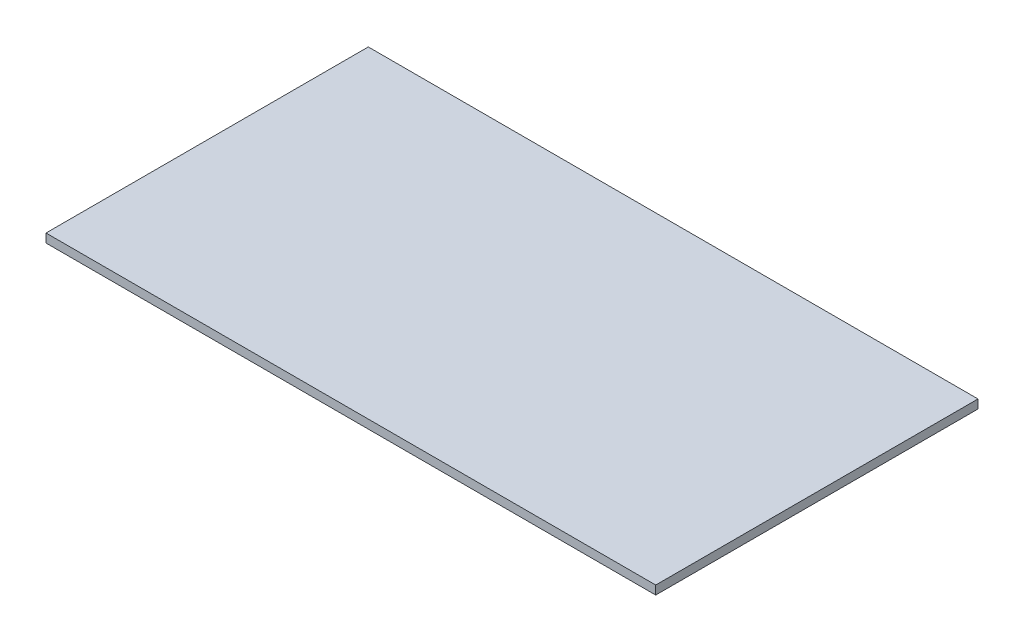
ISO-10303-21;
HEADER;
FILE_DESCRIPTION(('STEP AP214'),'2;1');
FILE_NAME('part.step','',(''),(''),'','','');
FILE_SCHEMA(('AUTOMOTIVE_DESIGN { 1 0 10303 214 1 1 1 1 }'));
ENDSEC;
DATA;
#1=APPLICATION_CONTEXT('core data for automotive mechanical design processes');
#2=APPLICATION_PROTOCOL_DEFINITION('international standard','automotive_design',2000,#1);
#3=PRODUCT_CONTEXT('',#1,'mechanical');
#4=PRODUCT('Part','Part','',(#3));
#5=PRODUCT_RELATED_PRODUCT_CATEGORY('part','',(#4));
#6=PRODUCT_DEFINITION_FORMATION('','',#4);
#7=PRODUCT_DEFINITION_CONTEXT('part definition',#1,'design');
#8=PRODUCT_DEFINITION('design','',#6,#7);
#9=PRODUCT_DEFINITION_SHAPE('','',#8);
#10=(LENGTH_UNIT() NAMED_UNIT(*) SI_UNIT(.MILLI.,.METRE.));
#11=(NAMED_UNIT(*) PLANE_ANGLE_UNIT() SI_UNIT($,.RADIAN.));
#12=(NAMED_UNIT(*) SI_UNIT($,.STERADIAN.) SOLID_ANGLE_UNIT());
#13=UNCERTAINTY_MEASURE_WITH_UNIT(LENGTH_MEASURE(1.E-05),#10,'distance_accuracy_value','');
#14=(GEOMETRIC_REPRESENTATION_CONTEXT(3) GLOBAL_UNCERTAINTY_ASSIGNED_CONTEXT((#13)) GLOBAL_UNIT_ASSIGNED_CONTEXT((#10,
#11,#12)) REPRESENTATION_CONTEXT('',''));
#15=CARTESIAN_POINT('',(0.,0.,0.));
#16=DIRECTION('',(0.,0.,1.));
#17=DIRECTION('',(1.,0.,0.));
#18=AXIS2_PLACEMENT_3D('',#15,#16,#17);
#19=CARTESIAN_POINT('',(-175.,5.,92.5));
#20=DIRECTION('',(1.,0.,0.));
#21=DIRECTION('',(0.,0.,-1.));
#22=AXIS2_PLACEMENT_3D('',#19,#20,#21);
#23=PLANE('',#22);
#24=DIRECTION('',(0.,0.,1.));
#25=VECTOR('',#24,1.);
#26=CARTESIAN_POINT('',(-175.,0.,92.5));
#27=LINE('',#26,#25);
#28=CARTESIAN_POINT('',(-175.,0.,-92.5));
#29=VERTEX_POINT('',#28);
#30=CARTESIAN_POINT('',(-175.,0.,92.5));
#31=VERTEX_POINT('',#30);
#32=EDGE_CURVE('E96',#29,#31,#27,.T.);
#33=ORIENTED_EDGE('',*,*,#32,.T.);
#34=DIRECTION('',(0.,-1.,0.));
#35=VECTOR('',#34,1.);
#36=CARTESIAN_POINT('',(-175.,5.,92.5));
#37=LINE('',#36,#35);
#38=CARTESIAN_POINT('',(-175.,5.,92.5));
#39=VERTEX_POINT('',#38);
#40=EDGE_CURVE('E11',#39,#31,#37,.T.);
#41=ORIENTED_EDGE('',*,*,#40,.F.);
#42=DIRECTION('',(0.,0.,1.));
#43=VECTOR('',#42,1.);
#44=CARTESIAN_POINT('',(-175.,5.,92.5));
#45=LINE('',#44,#43);
#46=CARTESIAN_POINT('',(-175.,5.,-92.5));
#47=VERTEX_POINT('',#46);
#48=EDGE_CURVE('E84',#47,#39,#45,.T.);
#49=ORIENTED_EDGE('',*,*,#48,.F.);
#50=DIRECTION('',(0.,-1.,0.));
#51=VECTOR('',#50,1.);
#52=CARTESIAN_POINT('',(-175.,5.,-92.5));
#53=LINE('',#52,#51);
#54=EDGE_CURVE('E92',#47,#29,#53,.T.);
#55=ORIENTED_EDGE('',*,*,#54,.T.);
#56=EDGE_LOOP('',(#33,#41,#49,#55));
#57=FACE_BOUND('',#56,.T.);
#58=ADVANCED_FACE('F33',(#57),#23,.F.);
#59=CARTESIAN_POINT('',(175.,5.,92.5));
#60=DIRECTION('',(0.,0.,-1.));
#61=DIRECTION('',(-1.,0.,0.));
#62=AXIS2_PLACEMENT_3D('',#59,#60,#61);
#63=PLANE('',#62);
#64=DIRECTION('',(1.,0.,0.));
#65=VECTOR('',#64,1.);
#66=CARTESIAN_POINT('',(175.,0.,92.5));
#67=LINE('',#66,#65);
#68=CARTESIAN_POINT('',(175.,0.,92.5));
#69=VERTEX_POINT('',#68);
#70=EDGE_CURVE('E88',#31,#69,#67,.T.);
#71=ORIENTED_EDGE('',*,*,#70,.T.);
#72=DIRECTION('',(0.,-1.,0.));
#73=VECTOR('',#72,1.);
#74=CARTESIAN_POINT('',(175.,5.,92.5));
#75=LINE('',#74,#73);
#76=CARTESIAN_POINT('',(175.,5.,92.5));
#77=VERTEX_POINT('',#76);
#78=EDGE_CURVE('E41',#77,#69,#75,.T.);
#79=ORIENTED_EDGE('',*,*,#78,.F.);
#80=DIRECTION('',(1.,0.,0.));
#81=VECTOR('',#80,1.);
#82=CARTESIAN_POINT('',(175.,5.,92.5));
#83=LINE('',#82,#81);
#84=EDGE_CURVE('E79',#39,#77,#83,.T.);
#85=ORIENTED_EDGE('',*,*,#84,.F.);
#86=ORIENTED_EDGE('',*,*,#40,.T.);
#87=EDGE_LOOP('',(#71,#79,#85,#86));
#88=FACE_BOUND('',#87,.T.);
#89=ADVANCED_FACE('F87',(#88),#63,.F.);
#90=CARTESIAN_POINT('',(175.,5.,92.5));
#91=DIRECTION('',(-1.,0.,0.));
#92=DIRECTION('',(0.,0.,1.));
#93=AXIS2_PLACEMENT_3D('',#90,#91,#92);
#94=PLANE('',#93);
#95=DIRECTION('',(0.,0.,-1.));
#96=VECTOR('',#95,1.);
#97=CARTESIAN_POINT('',(175.,0.,92.5));
#98=LINE('',#97,#96);
#99=CARTESIAN_POINT('',(175.,0.,-92.5));
#100=VERTEX_POINT('',#99);
#101=EDGE_CURVE('E66',#69,#100,#98,.T.);
#102=ORIENTED_EDGE('',*,*,#101,.T.);
#103=DIRECTION('',(0.,-1.,0.));
#104=VECTOR('',#103,1.);
#105=CARTESIAN_POINT('',(175.,5.,-92.5));
#106=LINE('',#105,#104);
#107=CARTESIAN_POINT('',(175.,5.,-92.5));
#108=VERTEX_POINT('',#107);
#109=EDGE_CURVE('E89',#108,#100,#106,.T.);
#110=ORIENTED_EDGE('',*,*,#109,.F.);
#111=DIRECTION('',(0.,0.,-1.));
#112=VECTOR('',#111,1.);
#113=CARTESIAN_POINT('',(175.,5.,92.5));
#114=LINE('',#113,#112);
#115=EDGE_CURVE('E82',#77,#108,#114,.T.);
#116=ORIENTED_EDGE('',*,*,#115,.F.);
#117=ORIENTED_EDGE('',*,*,#78,.T.);
#118=EDGE_LOOP('',(#102,#110,#116,#117));
#119=FACE_BOUND('',#118,.T.);
#120=ADVANCED_FACE('F90',(#119),#94,.F.);
#121=CARTESIAN_POINT('',(175.,5.,-92.5));
#122=DIRECTION('',(0.,0.,1.));
#123=DIRECTION('',(1.,0.,0.));
#124=AXIS2_PLACEMENT_3D('',#121,#122,#123);
#125=PLANE('',#124);
#126=DIRECTION('',(-1.,0.,0.));
#127=VECTOR('',#126,1.);
#128=CARTESIAN_POINT('',(175.,0.,-92.5));
#129=LINE('',#128,#127);
#130=EDGE_CURVE('E72',#100,#29,#129,.T.);
#131=ORIENTED_EDGE('',*,*,#130,.T.);
#132=ORIENTED_EDGE('',*,*,#54,.F.);
#133=DIRECTION('',(-1.,0.,0.));
#134=VECTOR('',#133,1.);
#135=CARTESIAN_POINT('',(175.,5.,-92.5));
#136=LINE('',#135,#134);
#137=EDGE_CURVE('E49',#108,#47,#136,.T.);
#138=ORIENTED_EDGE('',*,*,#137,.F.);
#139=ORIENTED_EDGE('',*,*,#109,.T.);
#140=EDGE_LOOP('',(#131,#132,#138,#139));
#141=FACE_BOUND('',#140,.T.);
#142=ADVANCED_FACE('F103',(#141),#125,.F.);
#143=CARTESIAN_POINT('',(0.,5.,0.));
#144=DIRECTION('',(0.,1.,0.));
#145=DIRECTION('',(0.,0.,1.));
#146=AXIS2_PLACEMENT_3D('',#143,#144,#145);
#147=PLANE('',#146);
#148=ORIENTED_EDGE('',*,*,#48,.T.);
#149=ORIENTED_EDGE('',*,*,#84,.T.);
#150=ORIENTED_EDGE('',*,*,#115,.T.);
#151=ORIENTED_EDGE('',*,*,#137,.T.);
#152=EDGE_LOOP('',(#148,#149,#150,#151));
#153=FACE_BOUND('',#152,.T.);
#154=ADVANCED_FACE('F80',(#153),#147,.T.);
#155=CARTESIAN_POINT('',(0.,0.,0.));
#156=DIRECTION('',(0.,1.,0.));
#157=DIRECTION('',(0.,0.,1.));
#158=AXIS2_PLACEMENT_3D('',#155,#156,#157);
#159=PLANE('',#158);
#160=ORIENTED_EDGE('',*,*,#32,.F.);
#161=ORIENTED_EDGE('',*,*,#130,.F.);
#162=ORIENTED_EDGE('',*,*,#101,.F.);
#163=ORIENTED_EDGE('',*,*,#70,.F.);
#164=EDGE_LOOP('',(#160,#161,#162,#163));
#165=FACE_BOUND('',#164,.T.);
#166=ADVANCED_FACE('F106',(#165),#159,.F.);
#167=CLOSED_SHELL('',(#58,#89,#120,#142,#154,#166));
#168=MANIFOLD_SOLID_BREP('B2',#167);
#169=ADVANCED_BREP_SHAPE_REPRESENTATION('',(#18,#168),#14);
#170=SHAPE_DEFINITION_REPRESENTATION(#9,#169);
ENDSEC;
END-ISO-10303-21;
